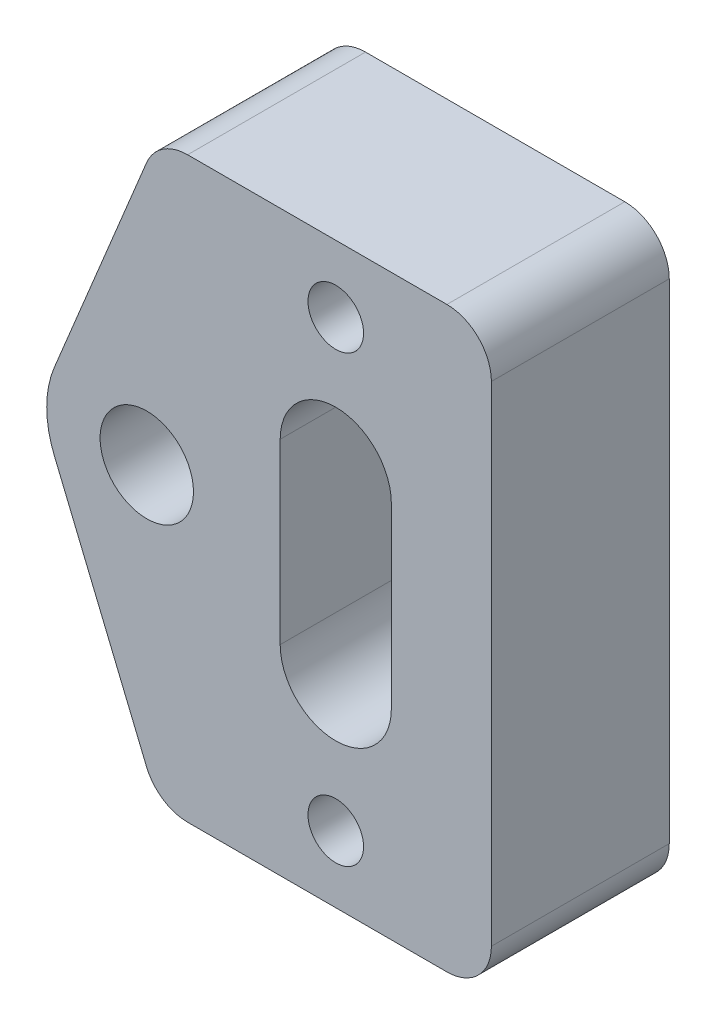
ISO-10303-21;
HEADER;
FILE_DESCRIPTION(('STEP AP214'),'2;1');
FILE_NAME('part.step','',(''),(''),'','','');
FILE_SCHEMA(('AUTOMOTIVE_DESIGN { 1 0 10303 214 1 1 1 1 }'));
ENDSEC;
DATA;
#1=APPLICATION_CONTEXT('core data for automotive mechanical design processes');
#2=APPLICATION_PROTOCOL_DEFINITION('international standard','automotive_design',2000,#1);
#3=PRODUCT_CONTEXT('',#1,'mechanical');
#4=PRODUCT('Part','Part','',(#3));
#5=PRODUCT_RELATED_PRODUCT_CATEGORY('part','',(#4));
#6=PRODUCT_DEFINITION_FORMATION('','',#4);
#7=PRODUCT_DEFINITION_CONTEXT('part definition',#1,'design');
#8=PRODUCT_DEFINITION('design','',#6,#7);
#9=PRODUCT_DEFINITION_SHAPE('','',#8);
#10=(LENGTH_UNIT() NAMED_UNIT(*) SI_UNIT(.MILLI.,.METRE.));
#11=(NAMED_UNIT(*) PLANE_ANGLE_UNIT() SI_UNIT($,.RADIAN.));
#12=(NAMED_UNIT(*) SI_UNIT($,.STERADIAN.) SOLID_ANGLE_UNIT());
#13=UNCERTAINTY_MEASURE_WITH_UNIT(LENGTH_MEASURE(1.E-05),#10,'distance_accuracy_value','');
#14=(GEOMETRIC_REPRESENTATION_CONTEXT(3) GLOBAL_UNCERTAINTY_ASSIGNED_CONTEXT((#13)) GLOBAL_UNIT_ASSIGNED_CONTEXT((#10,
#11,#12)) REPRESENTATION_CONTEXT('',''));
#15=CARTESIAN_POINT('',(0.,0.,0.));
#16=DIRECTION('',(0.,0.,1.));
#17=DIRECTION('',(1.,0.,0.));
#18=AXIS2_PLACEMENT_3D('',#15,#16,#17);
#19=CARTESIAN_POINT('',(0.,0.,0.));
#20=DIRECTION('',(0.,0.,1.));
#21=DIRECTION('',(1.,0.,0.));
#22=AXIS2_PLACEMENT_3D('',#19,#20,#21);
#23=PLANE('',#22);
#24=DIRECTION('',(0.,-1.,0.));
#25=VECTOR('',#24,1.);
#26=CARTESIAN_POINT('',(11.,4.,0.));
#27=LINE('',#26,#25);
#28=CARTESIAN_POINT('',(11.,4.,0.));
#29=VERTEX_POINT('',#28);
#30=CARTESIAN_POINT('',(11.,-4.,0.));
#31=VERTEX_POINT('',#30);
#32=EDGE_CURVE('E153',#29,#31,#27,.T.);
#33=ORIENTED_EDGE('',*,*,#32,.F.);
#34=CARTESIAN_POINT('',(8.50000000000001,4.,0.));
#35=DIRECTION('',(0.,0.,-1.));
#36=DIRECTION('',(-1.,0.,0.));
#37=AXIS2_PLACEMENT_3D('',#34,#35,#36);
#38=CIRCLE('',#37,2.5);
#39=CARTESIAN_POINT('',(6.00000000000001,4.,0.));
#40=VERTEX_POINT('',#39);
#41=EDGE_CURVE('E56',#40,#29,#38,.T.);
#42=ORIENTED_EDGE('',*,*,#41,.F.);
#43=DIRECTION('',(0.,1.,0.));
#44=VECTOR('',#43,1.);
#45=CARTESIAN_POINT('',(6.00000000000001,4.,0.));
#46=LINE('',#45,#44);
#47=CARTESIAN_POINT('',(6.,-4.,0.));
#48=VERTEX_POINT('',#47);
#49=EDGE_CURVE('E159',#48,#40,#46,.T.);
#50=ORIENTED_EDGE('',*,*,#49,.F.);
#51=CARTESIAN_POINT('',(8.5,-4.,0.));
#52=DIRECTION('',(0.,0.,-1.));
#53=DIRECTION('',(-1.,0.,0.));
#54=AXIS2_PLACEMENT_3D('',#51,#52,#53);
#55=CIRCLE('',#54,2.5);
#56=EDGE_CURVE('E144',#31,#48,#55,.T.);
#57=ORIENTED_EDGE('',*,*,#56,.F.);
#58=EDGE_LOOP('',(#33,#42,#50,#57));
#59=FACE_BOUND('',#58,.T.);
#60=CARTESIAN_POINT('',(8.5,-10.,0.));
#61=DIRECTION('',(0.,0.,1.));
#62=DIRECTION('',(1.,0.,0.));
#63=AXIS2_PLACEMENT_3D('',#60,#61,#62);
#64=CIRCLE('',#63,1.25);
#65=CARTESIAN_POINT('',(9.75,-10.,0.));
#66=VERTEX_POINT('',#65);
#67=EDGE_CURVE('E188',#66,#66,#64,.T.);
#68=ORIENTED_EDGE('',*,*,#67,.T.);
#69=EDGE_LOOP('',(#68));
#70=FACE_BOUND('',#69,.T.);
#71=CARTESIAN_POINT('',(8.5,10.,0.));
#72=DIRECTION('',(0.,0.,1.));
#73=DIRECTION('',(1.,0.,0.));
#74=AXIS2_PLACEMENT_3D('',#71,#72,#73);
#75=CIRCLE('',#74,1.25);
#76=CARTESIAN_POINT('',(9.75,10.,0.));
#77=VERTEX_POINT('',#76);
#78=EDGE_CURVE('E182',#77,#77,#75,.T.);
#79=ORIENTED_EDGE('',*,*,#78,.T.);
#80=EDGE_LOOP('',(#79));
#81=FACE_BOUND('',#80,.T.);
#82=CARTESIAN_POINT('',(0.,0.,0.));
#83=DIRECTION('',(0.,0.,-1.));
#84=DIRECTION('',(-1.,0.,0.));
#85=AXIS2_PLACEMENT_3D('',#82,#83,#84);
#86=CIRCLE('',#85,4.5);
#87=CARTESIAN_POINT('',(-4.15928214783115,1.7176646979935,0.));
#88=VERTEX_POINT('',#87);
#89=CARTESIAN_POINT('',(-4.15928214783115,-1.71766469799351,0.));
#90=VERTEX_POINT('',#89);
#91=EDGE_CURVE('E174',#88,#90,#86,.T.);
#92=ORIENTED_EDGE('',*,*,#91,.F.);
#93=DIRECTION('',(-0.381703266220779,-0.924284921740255,0.));
#94=VECTOR('',#93,1.);
#95=CARTESIAN_POINT('',(-4.15928214783115,1.71766469799351,0.));
#96=LINE('',#95,#94);
#97=CARTESIAN_POINT('',(-0.0106777731109448,11.7634065324416,0.));
#98=VERTEX_POINT('',#97);
#99=EDGE_CURVE('E196',#98,#88,#96,.T.);
#100=ORIENTED_EDGE('',*,*,#99,.F.);
#101=CARTESIAN_POINT('',(1.83789207036957,11.,0.));
#102=DIRECTION('',(0.,0.,1.));
#103=DIRECTION('',(1.,0.,0.));
#104=AXIS2_PLACEMENT_3D('',#101,#102,#103);
#105=CIRCLE('',#104,2.);
#106=CARTESIAN_POINT('',(1.83789207036957,13.,0.));
#107=VERTEX_POINT('',#106);
#108=EDGE_CURVE('E238',#98,#107,#105,.F.);
#109=ORIENTED_EDGE('',*,*,#108,.T.);
#110=DIRECTION('',(-1.,0.,0.));
#111=VECTOR('',#110,1.);
#112=CARTESIAN_POINT('',(0.5,13.,0.));
#113=LINE('',#112,#111);
#114=CARTESIAN_POINT('',(13.5,13.,0.));
#115=VERTEX_POINT('',#114);
#116=EDGE_CURVE('E219',#115,#107,#113,.T.);
#117=ORIENTED_EDGE('',*,*,#116,.F.);
#118=CARTESIAN_POINT('',(13.5,11.,0.));
#119=DIRECTION('',(0.,0.,1.));
#120=DIRECTION('',(1.,0.,0.));
#121=AXIS2_PLACEMENT_3D('',#118,#119,#120);
#122=CIRCLE('',#121,2.);
#123=CARTESIAN_POINT('',(15.5,11.,0.));
#124=VERTEX_POINT('',#123);
#125=EDGE_CURVE('E236',#115,#124,#122,.F.);
#126=ORIENTED_EDGE('',*,*,#125,.T.);
#127=DIRECTION('',(0.,1.,0.));
#128=VECTOR('',#127,1.);
#129=CARTESIAN_POINT('',(15.5,-13.,0.));
#130=LINE('',#129,#128);
#131=CARTESIAN_POINT('',(15.5,-11.,0.));
#132=VERTEX_POINT('',#131);
#133=EDGE_CURVE('E216',#132,#124,#130,.T.);
#134=ORIENTED_EDGE('',*,*,#133,.F.);
#135=CARTESIAN_POINT('',(13.5,-11.,0.));
#136=DIRECTION('',(0.,0.,1.));
#137=DIRECTION('',(1.,0.,0.));
#138=AXIS2_PLACEMENT_3D('',#135,#136,#137);
#139=CIRCLE('',#138,2.);
#140=CARTESIAN_POINT('',(13.5,-13.,0.));
#141=VERTEX_POINT('',#140);
#142=EDGE_CURVE('E232',#132,#141,#139,.F.);
#143=ORIENTED_EDGE('',*,*,#142,.T.);
#144=DIRECTION('',(1.,0.,0.));
#145=VECTOR('',#144,1.);
#146=CARTESIAN_POINT('',(0.5,-13.,0.));
#147=LINE('',#146,#145);
#148=CARTESIAN_POINT('',(1.83789207036957,-13.,0.));
#149=VERTEX_POINT('',#148);
#150=EDGE_CURVE('E213',#149,#141,#147,.T.);
#151=ORIENTED_EDGE('',*,*,#150,.F.);
#152=CARTESIAN_POINT('',(1.83789207036957,-11.,0.));
#153=DIRECTION('',(0.,0.,1.));
#154=DIRECTION('',(1.,0.,0.));
#155=AXIS2_PLACEMENT_3D('',#152,#153,#154);
#156=CIRCLE('',#155,2.);
#157=CARTESIAN_POINT('',(-0.0106777731109457,-11.7634065324416,0.));
#158=VERTEX_POINT('',#157);
#159=EDGE_CURVE('E234',#149,#158,#156,.F.);
#160=ORIENTED_EDGE('',*,*,#159,.T.);
#161=DIRECTION('',(0.381703266220779,-0.924284921740255,0.));
#162=VECTOR('',#161,1.);
#163=CARTESIAN_POINT('',(-4.15928214783115,-1.71766469799351,0.));
#164=LINE('',#163,#162);
#165=EDGE_CURVE('E191',#90,#158,#164,.T.);
#166=ORIENTED_EDGE('',*,*,#165,.F.);
#167=EDGE_LOOP('',(#92,#100,#109,#117,#126,#134,#143,#151,#160,#166));
#168=FACE_BOUND('',#167,.T.);
#169=ADVANCED_FACE('F41',(#59,#70,#81,#168),#23,.F.);
#170=CARTESIAN_POINT('',(0.,0.,8.));
#171=DIRECTION('',(0.,0.,1.));
#172=DIRECTION('',(1.,0.,0.));
#173=AXIS2_PLACEMENT_3D('',#170,#171,#172);
#174=PLANE('',#173);
#175=CARTESIAN_POINT('',(8.50000000000001,4.,8.));
#176=DIRECTION('',(0.,0.,1.));
#177=DIRECTION('',(1.,0.,0.));
#178=AXIS2_PLACEMENT_3D('',#175,#176,#177);
#179=CIRCLE('',#178,2.5);
#180=CARTESIAN_POINT('',(11.,4.,8.));
#181=VERTEX_POINT('',#180);
#182=CARTESIAN_POINT('',(6.00000000000001,4.,8.));
#183=VERTEX_POINT('',#182);
#184=EDGE_CURVE('E11',#181,#183,#179,.T.);
#185=ORIENTED_EDGE('',*,*,#184,.F.);
#186=DIRECTION('',(0.,1.,0.));
#187=VECTOR('',#186,1.);
#188=CARTESIAN_POINT('',(11.,0.,8.));
#189=LINE('',#188,#187);
#190=CARTESIAN_POINT('',(11.,-4.,8.));
#191=VERTEX_POINT('',#190);
#192=EDGE_CURVE('E265',#191,#181,#189,.T.);
#193=ORIENTED_EDGE('',*,*,#192,.F.);
#194=CARTESIAN_POINT('',(8.5,-4.,8.));
#195=DIRECTION('',(0.,0.,1.));
#196=DIRECTION('',(1.,0.,0.));
#197=AXIS2_PLACEMENT_3D('',#194,#195,#196);
#198=CIRCLE('',#197,2.5);
#199=CARTESIAN_POINT('',(6.,-4.,8.));
#200=VERTEX_POINT('',#199);
#201=EDGE_CURVE('E147',#200,#191,#198,.T.);
#202=ORIENTED_EDGE('',*,*,#201,.F.);
#203=DIRECTION('',(0.,-1.,0.));
#204=VECTOR('',#203,1.);
#205=CARTESIAN_POINT('',(6.00000000000001,0.,8.));
#206=LINE('',#205,#204);
#207=EDGE_CURVE('E49',#183,#200,#206,.T.);
#208=ORIENTED_EDGE('',*,*,#207,.F.);
#209=EDGE_LOOP('',(#185,#193,#202,#208));
#210=FACE_BOUND('',#209,.T.);
#211=CARTESIAN_POINT('',(0.,0.,8.));
#212=DIRECTION('',(0.,0.,1.));
#213=DIRECTION('',(1.,0.,0.));
#214=AXIS2_PLACEMENT_3D('',#211,#212,#213);
#215=CIRCLE('',#214,2.1);
#216=CARTESIAN_POINT('',(2.1,0.,8.));
#217=VERTEX_POINT('',#216);
#218=EDGE_CURVE('E166',#217,#217,#215,.T.);
#219=ORIENTED_EDGE('',*,*,#218,.F.);
#220=EDGE_LOOP('',(#219));
#221=FACE_BOUND('',#220,.T.);
#222=CARTESIAN_POINT('',(8.5,10.,8.));
#223=DIRECTION('',(0.,0.,1.));
#224=DIRECTION('',(1.,0.,0.));
#225=AXIS2_PLACEMENT_3D('',#222,#223,#224);
#226=CIRCLE('',#225,1.24999999999999);
#227=CARTESIAN_POINT('',(9.74999999999999,10.,8.));
#228=VERTEX_POINT('',#227);
#229=EDGE_CURVE('E178',#228,#228,#226,.T.);
#230=ORIENTED_EDGE('',*,*,#229,.F.);
#231=EDGE_LOOP('',(#230));
#232=FACE_BOUND('',#231,.T.);
#233=CARTESIAN_POINT('',(8.5,-10.,8.));
#234=DIRECTION('',(0.,0.,1.));
#235=DIRECTION('',(1.,0.,0.));
#236=AXIS2_PLACEMENT_3D('',#233,#234,#235);
#237=CIRCLE('',#236,1.24999999999999);
#238=CARTESIAN_POINT('',(9.74999999999999,-10.,8.));
#239=VERTEX_POINT('',#238);
#240=EDGE_CURVE('E185',#239,#239,#237,.T.);
#241=ORIENTED_EDGE('',*,*,#240,.F.);
#242=EDGE_LOOP('',(#241));
#243=FACE_BOUND('',#242,.T.);
#244=DIRECTION('',(-1.,0.,0.));
#245=VECTOR('',#244,1.);
#246=CARTESIAN_POINT('',(0.5,13.,8.));
#247=LINE('',#246,#245);
#248=CARTESIAN_POINT('',(13.5,13.,8.));
#249=VERTEX_POINT('',#248);
#250=CARTESIAN_POINT('',(1.83789207036957,13.,8.));
#251=VERTEX_POINT('',#250);
#252=EDGE_CURVE('E205',#249,#251,#247,.T.);
#253=ORIENTED_EDGE('',*,*,#252,.T.);
#254=CARTESIAN_POINT('',(1.83789207036957,11.,8.));
#255=DIRECTION('',(0.,0.,1.));
#256=DIRECTION('',(1.,0.,0.));
#257=AXIS2_PLACEMENT_3D('',#254,#255,#256);
#258=CIRCLE('',#257,2.);
#259=CARTESIAN_POINT('',(-0.0106777731109448,11.7634065324416,8.));
#260=VERTEX_POINT('',#259);
#261=EDGE_CURVE('E251',#251,#260,#258,.T.);
#262=ORIENTED_EDGE('',*,*,#261,.T.);
#263=DIRECTION('',(-0.381703266220779,-0.924284921740255,0.));
#264=VECTOR('',#263,1.);
#265=CARTESIAN_POINT('',(-4.15928214783115,1.71766469799351,8.));
#266=LINE('',#265,#264);
#267=CARTESIAN_POINT('',(-4.15928214783115,1.71766469799351,8.));
#268=VERTEX_POINT('',#267);
#269=EDGE_CURVE('E208',#260,#268,#266,.T.);
#270=ORIENTED_EDGE('',*,*,#269,.T.);
#271=CARTESIAN_POINT('',(0.,0.,8.));
#272=DIRECTION('',(0.,0.,1.));
#273=DIRECTION('',(1.,0.,0.));
#274=AXIS2_PLACEMENT_3D('',#271,#272,#273);
#275=CIRCLE('',#274,4.5);
#276=CARTESIAN_POINT('',(-4.15928214783115,-1.71766469799351,8.));
#277=VERTEX_POINT('',#276);
#278=EDGE_CURVE('E192',#268,#277,#275,.T.);
#279=ORIENTED_EDGE('',*,*,#278,.T.);
#280=DIRECTION('',(0.381703266220779,-0.924284921740255,0.));
#281=VECTOR('',#280,1.);
#282=CARTESIAN_POINT('',(-4.15928214783115,-1.71766469799351,8.));
#283=LINE('',#282,#281);
#284=CARTESIAN_POINT('',(-0.0106777731109457,-11.7634065324416,8.));
#285=VERTEX_POINT('',#284);
#286=EDGE_CURVE('E195',#277,#285,#283,.T.);
#287=ORIENTED_EDGE('',*,*,#286,.T.);
#288=CARTESIAN_POINT('',(1.83789207036957,-11.,8.));
#289=DIRECTION('',(0.,0.,1.));
#290=DIRECTION('',(1.,0.,0.));
#291=AXIS2_PLACEMENT_3D('',#288,#289,#290);
#292=CIRCLE('',#291,2.);
#293=CARTESIAN_POINT('',(1.83789207036957,-13.,8.));
#294=VERTEX_POINT('',#293);
#295=EDGE_CURVE('E247',#285,#294,#292,.T.);
#296=ORIENTED_EDGE('',*,*,#295,.T.);
#297=DIRECTION('',(1.,0.,0.));
#298=VECTOR('',#297,1.);
#299=CARTESIAN_POINT('',(0.5,-13.,8.));
#300=LINE('',#299,#298);
#301=CARTESIAN_POINT('',(13.5,-13.,8.));
#302=VERTEX_POINT('',#301);
#303=EDGE_CURVE('E199',#294,#302,#300,.T.);
#304=ORIENTED_EDGE('',*,*,#303,.T.);
#305=CARTESIAN_POINT('',(13.5,-11.,8.));
#306=DIRECTION('',(0.,0.,1.));
#307=DIRECTION('',(1.,0.,0.));
#308=AXIS2_PLACEMENT_3D('',#305,#306,#307);
#309=CIRCLE('',#308,2.);
#310=CARTESIAN_POINT('',(15.5,-11.,8.));
#311=VERTEX_POINT('',#310);
#312=EDGE_CURVE('E245',#302,#311,#309,.T.);
#313=ORIENTED_EDGE('',*,*,#312,.T.);
#314=DIRECTION('',(0.,1.,0.));
#315=VECTOR('',#314,1.);
#316=CARTESIAN_POINT('',(15.5,-13.,8.));
#317=LINE('',#316,#315);
#318=CARTESIAN_POINT('',(15.5,11.,8.));
#319=VERTEX_POINT('',#318);
#320=EDGE_CURVE('E202',#311,#319,#317,.T.);
#321=ORIENTED_EDGE('',*,*,#320,.T.);
#322=CARTESIAN_POINT('',(13.5,11.,8.));
#323=DIRECTION('',(0.,0.,1.));
#324=DIRECTION('',(1.,0.,0.));
#325=AXIS2_PLACEMENT_3D('',#322,#323,#324);
#326=CIRCLE('',#325,2.);
#327=EDGE_CURVE('E249',#319,#249,#326,.T.);
#328=ORIENTED_EDGE('',*,*,#327,.T.);
#329=EDGE_LOOP('',(#253,#262,#270,#279,#287,#296,#304,#313,#321,#328));
#330=FACE_BOUND('',#329,.T.);
#331=ADVANCED_FACE('F273',(#210,#221,#232,#243,#330),#174,.T.);
#332=CARTESIAN_POINT('',(0.,0.,8.));
#333=DIRECTION('',(0.,0.,-1.));
#334=DIRECTION('',(-1.,0.,0.));
#335=AXIS2_PLACEMENT_3D('',#332,#333,#334);
#336=CYLINDRICAL_SURFACE('',#335,4.5);
#337=DIRECTION('',(0.,0.,-1.));
#338=VECTOR('',#337,1.);
#339=CARTESIAN_POINT('',(-4.15928214783115,1.71766469799351,8.));
#340=LINE('',#339,#338);
#341=EDGE_CURVE('E210',#268,#88,#340,.T.);
#342=ORIENTED_EDGE('',*,*,#341,.T.);
#343=ORIENTED_EDGE('',*,*,#91,.T.);
#344=DIRECTION('',(0.,0.,-1.));
#345=VECTOR('',#344,1.);
#346=CARTESIAN_POINT('',(-4.15928214783115,-1.71766469799351,8.));
#347=LINE('',#346,#345);
#348=EDGE_CURVE('E226',#277,#90,#347,.T.);
#349=ORIENTED_EDGE('',*,*,#348,.F.);
#350=ORIENTED_EDGE('',*,*,#278,.F.);
#351=EDGE_LOOP('',(#342,#343,#349,#350));
#352=FACE_BOUND('',#351,.T.);
#353=CARTESIAN_POINT('',(0.,0.,-2.3));
#354=DIRECTION('',(0.,0.,-1.));
#355=DIRECTION('',(-1.,0.,0.));
#356=AXIS2_PLACEMENT_3D('',#353,#354,#355);
#357=CIRCLE('',#356,4.5);
#358=CARTESIAN_POINT('',(-4.5,0.,-2.3));
#359=VERTEX_POINT('',#358);
#360=EDGE_CURVE('E175',#359,#359,#357,.T.);
#361=ORIENTED_EDGE('',*,*,#360,.F.);
#362=EDGE_LOOP('',(#361));
#363=FACE_BOUND('',#362,.T.);
#364=ADVANCED_FACE('F295',(#352,#363),#336,.T.);
#365=CARTESIAN_POINT('',(-4.15928214783115,-1.71766469799351,8.));
#366=DIRECTION('',(0.924284921740255,0.381703266220779,0.));
#367=DIRECTION('',(-0.381703266220779,0.924284921740255,0.));
#368=AXIS2_PLACEMENT_3D('',#365,#366,#367);
#369=PLANE('',#368);
#370=ORIENTED_EDGE('',*,*,#165,.T.);
#371=DIRECTION('',(0.,0.,-1.));
#372=VECTOR('',#371,1.);
#373=CARTESIAN_POINT('',(-0.0106777731109439,-11.7634065324416,8.));
#374=LINE('',#373,#372);
#375=EDGE_CURVE('E263',#158,#285,#374,.F.);
#376=ORIENTED_EDGE('',*,*,#375,.T.);
#377=ORIENTED_EDGE('',*,*,#286,.F.);
#378=ORIENTED_EDGE('',*,*,#348,.T.);
#379=EDGE_LOOP('',(#370,#376,#377,#378));
#380=FACE_BOUND('',#379,.T.);
#381=ADVANCED_FACE('F315',(#380),#369,.F.);
#382=CARTESIAN_POINT('',(0.5,-13.,8.));
#383=DIRECTION('',(0.,1.,0.));
#384=DIRECTION('',(0.,0.,1.));
#385=AXIS2_PLACEMENT_3D('',#382,#383,#384);
#386=PLANE('',#385);
#387=ORIENTED_EDGE('',*,*,#303,.F.);
#388=DIRECTION('',(0.,0.,-1.));
#389=VECTOR('',#388,1.);
#390=CARTESIAN_POINT('',(1.83789207036957,-13.,8.));
#391=LINE('',#390,#389);
#392=EDGE_CURVE('E260',#294,#149,#391,.T.);
#393=ORIENTED_EDGE('',*,*,#392,.T.);
#394=ORIENTED_EDGE('',*,*,#150,.T.);
#395=DIRECTION('',(0.,0.,-1.));
#396=VECTOR('',#395,1.);
#397=CARTESIAN_POINT('',(13.5,-13.,8.));
#398=LINE('',#397,#396);
#399=EDGE_CURVE('E258',#141,#302,#398,.F.);
#400=ORIENTED_EDGE('',*,*,#399,.T.);
#401=EDGE_LOOP('',(#387,#393,#394,#400));
#402=FACE_BOUND('',#401,.T.);
#403=ADVANCED_FACE('F311',(#402),#386,.F.);
#404=CARTESIAN_POINT('',(15.5,-13.,8.));
#405=DIRECTION('',(-1.,0.,0.));
#406=DIRECTION('',(0.,0.,1.));
#407=AXIS2_PLACEMENT_3D('',#404,#405,#406);
#408=PLANE('',#407);
#409=ORIENTED_EDGE('',*,*,#133,.T.);
#410=DIRECTION('',(0.,0.,-1.));
#411=VECTOR('',#410,1.);
#412=CARTESIAN_POINT('',(15.5,11.,8.));
#413=LINE('',#412,#411);
#414=EDGE_CURVE('E256',#124,#319,#413,.F.);
#415=ORIENTED_EDGE('',*,*,#414,.T.);
#416=ORIENTED_EDGE('',*,*,#320,.F.);
#417=DIRECTION('',(0.,0.,-1.));
#418=VECTOR('',#417,1.);
#419=CARTESIAN_POINT('',(15.5,-11.,8.));
#420=LINE('',#419,#418);
#421=EDGE_CURVE('E253',#311,#132,#420,.T.);
#422=ORIENTED_EDGE('',*,*,#421,.T.);
#423=EDGE_LOOP('',(#409,#415,#416,#422));
#424=FACE_BOUND('',#423,.T.);
#425=ADVANCED_FACE('F307',(#424),#408,.F.);
#426=CARTESIAN_POINT('',(0.5,13.,8.));
#427=DIRECTION('',(0.,-1.,0.));
#428=DIRECTION('',(0.,0.,-1.));
#429=AXIS2_PLACEMENT_3D('',#426,#427,#428);
#430=PLANE('',#429);
#431=ORIENTED_EDGE('',*,*,#116,.T.);
#432=DIRECTION('',(0.,0.,-1.));
#433=VECTOR('',#432,1.);
#434=CARTESIAN_POINT('',(1.83789207036957,13.,8.));
#435=LINE('',#434,#433);
#436=EDGE_CURVE('E243',#107,#251,#435,.F.);
#437=ORIENTED_EDGE('',*,*,#436,.T.);
#438=ORIENTED_EDGE('',*,*,#252,.F.);
#439=DIRECTION('',(0.,0.,-1.));
#440=VECTOR('',#439,1.);
#441=CARTESIAN_POINT('',(13.5,13.,8.));
#442=LINE('',#441,#440);
#443=EDGE_CURVE('E240',#249,#115,#442,.T.);
#444=ORIENTED_EDGE('',*,*,#443,.T.);
#445=EDGE_LOOP('',(#431,#437,#438,#444));
#446=FACE_BOUND('',#445,.T.);
#447=ADVANCED_FACE('F303',(#446),#430,.F.);
#448=CARTESIAN_POINT('',(-4.15928214783115,1.71766469799351,8.));
#449=DIRECTION('',(0.924284921740255,-0.381703266220779,0.));
#450=DIRECTION('',(0.381703266220779,0.924284921740255,0.));
#451=AXIS2_PLACEMENT_3D('',#448,#449,#450);
#452=PLANE('',#451);
#453=ORIENTED_EDGE('',*,*,#269,.F.);
#454=DIRECTION('',(0.,0.,-1.));
#455=VECTOR('',#454,1.);
#456=CARTESIAN_POINT('',(-0.0106777731109439,11.7634065324416,8.));
#457=LINE('',#456,#455);
#458=EDGE_CURVE('E229',#260,#98,#457,.T.);
#459=ORIENTED_EDGE('',*,*,#458,.T.);
#460=ORIENTED_EDGE('',*,*,#99,.T.);
#461=ORIENTED_EDGE('',*,*,#341,.F.);
#462=EDGE_LOOP('',(#453,#459,#460,#461));
#463=FACE_BOUND('',#462,.T.);
#464=ADVANCED_FACE('F299',(#463),#452,.F.);
#465=CARTESIAN_POINT('',(1.83789207036957,11.,8.));
#466=DIRECTION('',(0.,0.,-1.));
#467=DIRECTION('',(-1.,0.,0.));
#468=AXIS2_PLACEMENT_3D('',#465,#466,#467);
#469=CYLINDRICAL_SURFACE('',#468,2.);
#470=ORIENTED_EDGE('',*,*,#261,.F.);
#471=ORIENTED_EDGE('',*,*,#436,.F.);
#472=ORIENTED_EDGE('',*,*,#108,.F.);
#473=ORIENTED_EDGE('',*,*,#458,.F.);
#474=EDGE_LOOP('',(#470,#471,#472,#473));
#475=FACE_BOUND('',#474,.T.);
#476=ADVANCED_FACE('F302',(#475),#469,.T.);
#477=CARTESIAN_POINT('',(13.5,11.,8.));
#478=DIRECTION('',(0.,0.,-1.));
#479=DIRECTION('',(-1.,0.,0.));
#480=AXIS2_PLACEMENT_3D('',#477,#478,#479);
#481=CYLINDRICAL_SURFACE('',#480,2.);
#482=ORIENTED_EDGE('',*,*,#327,.F.);
#483=ORIENTED_EDGE('',*,*,#414,.F.);
#484=ORIENTED_EDGE('',*,*,#125,.F.);
#485=ORIENTED_EDGE('',*,*,#443,.F.);
#486=EDGE_LOOP('',(#482,#483,#484,#485));
#487=FACE_BOUND('',#486,.T.);
#488=ADVANCED_FACE('F325',(#487),#481,.T.);
#489=CARTESIAN_POINT('',(1.83789207036957,-11.,8.));
#490=DIRECTION('',(0.,0.,-1.));
#491=DIRECTION('',(-1.,0.,0.));
#492=AXIS2_PLACEMENT_3D('',#489,#490,#491);
#493=CYLINDRICAL_SURFACE('',#492,2.);
#494=ORIENTED_EDGE('',*,*,#295,.F.);
#495=ORIENTED_EDGE('',*,*,#375,.F.);
#496=ORIENTED_EDGE('',*,*,#159,.F.);
#497=ORIENTED_EDGE('',*,*,#392,.F.);
#498=EDGE_LOOP('',(#494,#495,#496,#497));
#499=FACE_BOUND('',#498,.T.);
#500=ADVANCED_FACE('F328',(#499),#493,.T.);
#501=CARTESIAN_POINT('',(13.5,-11.,8.));
#502=DIRECTION('',(0.,0.,-1.));
#503=DIRECTION('',(-1.,0.,0.));
#504=AXIS2_PLACEMENT_3D('',#501,#502,#503);
#505=CYLINDRICAL_SURFACE('',#504,2.);
#506=ORIENTED_EDGE('',*,*,#312,.F.);
#507=ORIENTED_EDGE('',*,*,#399,.F.);
#508=ORIENTED_EDGE('',*,*,#142,.F.);
#509=ORIENTED_EDGE('',*,*,#421,.F.);
#510=EDGE_LOOP('',(#506,#507,#508,#509));
#511=FACE_BOUND('',#510,.T.);
#512=ADVANCED_FACE('F43',(#511),#505,.T.);
#513=CARTESIAN_POINT('',(8.5,-10.,8.));
#514=DIRECTION('',(0.,0.,1.));
#515=DIRECTION('',(1.,0.,0.));
#516=AXIS2_PLACEMENT_3D('',#513,#514,#515);
#517=CYLINDRICAL_SURFACE('',#516,1.24999999999999);
#518=ORIENTED_EDGE('',*,*,#67,.F.);
#519=EDGE_LOOP('',(#518));
#520=FACE_BOUND('',#519,.T.);
#521=ORIENTED_EDGE('',*,*,#240,.T.);
#522=EDGE_LOOP('',(#521));
#523=FACE_BOUND('',#522,.T.);
#524=ADVANCED_FACE('F335',(#520,#523),#517,.F.);
#525=CARTESIAN_POINT('',(8.5,10.,8.));
#526=DIRECTION('',(0.,0.,1.));
#527=DIRECTION('',(1.,0.,0.));
#528=AXIS2_PLACEMENT_3D('',#525,#526,#527);
#529=CYLINDRICAL_SURFACE('',#528,1.24999999999999);
#530=ORIENTED_EDGE('',*,*,#78,.F.);
#531=EDGE_LOOP('',(#530));
#532=FACE_BOUND('',#531,.T.);
#533=ORIENTED_EDGE('',*,*,#229,.T.);
#534=EDGE_LOOP('',(#533));
#535=FACE_BOUND('',#534,.T.);
#536=ADVANCED_FACE('F367',(#532,#535),#529,.F.);
#537=CARTESIAN_POINT('',(0.,0.,-2.3));
#538=DIRECTION('',(0.,0.,-1.));
#539=DIRECTION('',(-1.,0.,0.));
#540=AXIS2_PLACEMENT_3D('',#537,#538,#539);
#541=PLANE('',#540);
#542=CARTESIAN_POINT('',(0.,0.,-2.3));
#543=DIRECTION('',(0.,0.,-1.));
#544=DIRECTION('',(-1.,0.,0.));
#545=AXIS2_PLACEMENT_3D('',#542,#543,#544);
#546=CIRCLE('',#545,2.1);
#547=CARTESIAN_POINT('',(-2.1,0.,-2.3));
#548=VERTEX_POINT('',#547);
#549=EDGE_CURVE('E171',#548,#548,#546,.T.);
#550=ORIENTED_EDGE('',*,*,#549,.F.);
#551=EDGE_LOOP('',(#550));
#552=FACE_BOUND('',#551,.T.);
#553=ORIENTED_EDGE('',*,*,#360,.T.);
#554=EDGE_LOOP('',(#553));
#555=FACE_BOUND('',#554,.T.);
#556=ADVANCED_FACE('F285',(#552,#555),#541,.T.);
#557=CARTESIAN_POINT('',(0.,0.,8.));
#558=DIRECTION('',(0.,0.,1.));
#559=DIRECTION('',(1.,0.,0.));
#560=AXIS2_PLACEMENT_3D('',#557,#558,#559);
#561=CYLINDRICAL_SURFACE('',#560,2.1);
#562=ORIENTED_EDGE('',*,*,#549,.T.);
#563=EDGE_LOOP('',(#562));
#564=FACE_BOUND('',#563,.T.);
#565=ORIENTED_EDGE('',*,*,#218,.T.);
#566=EDGE_LOOP('',(#565));
#567=FACE_BOUND('',#566,.T.);
#568=ADVANCED_FACE('F277',(#564,#567),#561,.F.);
#569=CARTESIAN_POINT('',(8.50000000000001,4.,20.));
#570=DIRECTION('',(0.,0.,-1.));
#571=DIRECTION('',(-1.,0.,0.));
#572=AXIS2_PLACEMENT_3D('',#569,#570,#571);
#573=CYLINDRICAL_SURFACE('',#572,2.5);
#574=ORIENTED_EDGE('',*,*,#184,.T.);
#575=DIRECTION('',(0.,0.,-1.));
#576=VECTOR('',#575,1.);
#577=CARTESIAN_POINT('',(6.00000000000001,4.,20.));
#578=LINE('',#577,#576);
#579=EDGE_CURVE('E164',#183,#40,#578,.T.);
#580=ORIENTED_EDGE('',*,*,#579,.T.);
#581=ORIENTED_EDGE('',*,*,#41,.T.);
#582=DIRECTION('',(0.,0.,-1.));
#583=VECTOR('',#582,1.);
#584=CARTESIAN_POINT('',(11.,4.,20.));
#585=LINE('',#584,#583);
#586=EDGE_CURVE('E150',#181,#29,#585,.T.);
#587=ORIENTED_EDGE('',*,*,#586,.F.);
#588=EDGE_LOOP('',(#574,#580,#581,#587));
#589=FACE_BOUND('',#588,.T.);
#590=ADVANCED_FACE('F275',(#589),#573,.F.);
#591=CARTESIAN_POINT('',(6.00000000000001,4.,20.));
#592=DIRECTION('',(-1.,0.,0.));
#593=DIRECTION('',(0.,-1.,0.));
#594=AXIS2_PLACEMENT_3D('',#591,#592,#593);
#595=PLANE('',#594);
#596=ORIENTED_EDGE('',*,*,#207,.T.);
#597=DIRECTION('',(0.,0.,-1.));
#598=VECTOR('',#597,1.);
#599=CARTESIAN_POINT('',(6.,-4.,20.));
#600=LINE('',#599,#598);
#601=EDGE_CURVE('E149',#200,#48,#600,.T.);
#602=ORIENTED_EDGE('',*,*,#601,.T.);
#603=ORIENTED_EDGE('',*,*,#49,.T.);
#604=ORIENTED_EDGE('',*,*,#579,.F.);
#605=EDGE_LOOP('',(#596,#602,#603,#604));
#606=FACE_BOUND('',#605,.T.);
#607=ADVANCED_FACE('F270',(#606),#595,.F.);
#608=CARTESIAN_POINT('',(8.5,-4.,20.));
#609=DIRECTION('',(0.,0.,-1.));
#610=DIRECTION('',(-1.,0.,0.));
#611=AXIS2_PLACEMENT_3D('',#608,#609,#610);
#612=CYLINDRICAL_SURFACE('',#611,2.5);
#613=ORIENTED_EDGE('',*,*,#201,.T.);
#614=DIRECTION('',(0.,0.,-1.));
#615=VECTOR('',#614,1.);
#616=CARTESIAN_POINT('',(11.,-4.,20.));
#617=LINE('',#616,#615);
#618=EDGE_CURVE('E64',#191,#31,#617,.T.);
#619=ORIENTED_EDGE('',*,*,#618,.T.);
#620=ORIENTED_EDGE('',*,*,#56,.T.);
#621=ORIENTED_EDGE('',*,*,#601,.F.);
#622=EDGE_LOOP('',(#613,#619,#620,#621));
#623=FACE_BOUND('',#622,.T.);
#624=ADVANCED_FACE('F141',(#623),#612,.F.);
#625=CARTESIAN_POINT('',(11.,4.,20.));
#626=DIRECTION('',(1.,0.,0.));
#627=DIRECTION('',(0.,1.,0.));
#628=AXIS2_PLACEMENT_3D('',#625,#626,#627);
#629=PLANE('',#628);
#630=ORIENTED_EDGE('',*,*,#192,.T.);
#631=ORIENTED_EDGE('',*,*,#586,.T.);
#632=ORIENTED_EDGE('',*,*,#32,.T.);
#633=ORIENTED_EDGE('',*,*,#618,.F.);
#634=EDGE_LOOP('',(#630,#631,#632,#633));
#635=FACE_BOUND('',#634,.T.);
#636=ADVANCED_FACE('F154',(#635),#629,.F.);
#637=CLOSED_SHELL('',(#169,#331,#364,#381,#403,#425,#447,#464,#476,#488,#500,#512,#524,#536,
#556,#568,#590,#607,#624,#636));
#638=MANIFOLD_SOLID_BREP('B2',#637);
#639=ADVANCED_BREP_SHAPE_REPRESENTATION('',(#18,#638),#14);
#640=SHAPE_DEFINITION_REPRESENTATION(#9,#639);
ENDSEC;
END-ISO-10303-21;
